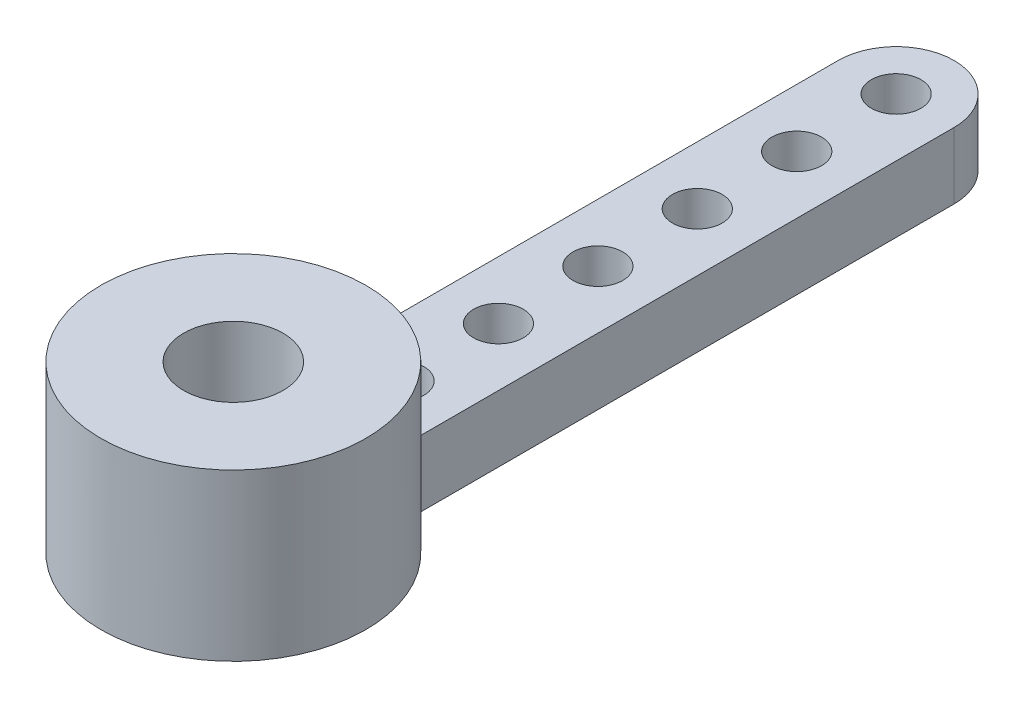
ISO-10303-21;
HEADER;
FILE_DESCRIPTION(('STEP AP214'),'2;1');
FILE_NAME('part.step','',(''),(''),'','','');
FILE_SCHEMA(('AUTOMOTIVE_DESIGN { 1 0 10303 214 1 1 1 1 }'));
ENDSEC;
DATA;
#1=APPLICATION_CONTEXT('core data for automotive mechanical design processes');
#2=APPLICATION_PROTOCOL_DEFINITION('international standard','automotive_design',2000,#1);
#3=PRODUCT_CONTEXT('',#1,'mechanical');
#4=PRODUCT('Part','Part','',(#3));
#5=PRODUCT_RELATED_PRODUCT_CATEGORY('part','',(#4));
#6=PRODUCT_DEFINITION_FORMATION('','',#4);
#7=PRODUCT_DEFINITION_CONTEXT('part definition',#1,'design');
#8=PRODUCT_DEFINITION('design','',#6,#7);
#9=PRODUCT_DEFINITION_SHAPE('','',#8);
#10=(LENGTH_UNIT() NAMED_UNIT(*) SI_UNIT(.MILLI.,.METRE.));
#11=(NAMED_UNIT(*) PLANE_ANGLE_UNIT() SI_UNIT($,.RADIAN.));
#12=(NAMED_UNIT(*) SI_UNIT($,.STERADIAN.) SOLID_ANGLE_UNIT());
#13=UNCERTAINTY_MEASURE_WITH_UNIT(LENGTH_MEASURE(1.E-05),#10,'distance_accuracy_value','');
#14=(GEOMETRIC_REPRESENTATION_CONTEXT(3) GLOBAL_UNCERTAINTY_ASSIGNED_CONTEXT((#13)) GLOBAL_UNIT_ASSIGNED_CONTEXT((#10,
#11,#12)) REPRESENTATION_CONTEXT('',''));
#15=CARTESIAN_POINT('',(0.,0.,0.));
#16=DIRECTION('',(0.,0.,1.));
#17=DIRECTION('',(1.,0.,0.));
#18=AXIS2_PLACEMENT_3D('',#15,#16,#17);
#19=CARTESIAN_POINT('',(-3.5,10.,0.));
#20=DIRECTION('',(1.,0.,0.));
#21=DIRECTION('',(0.,0.,1.));
#22=AXIS2_PLACEMENT_3D('',#19,#20,#21);
#23=PLANE('',#22);
#24=DIRECTION('',(0.,0.,-1.));
#25=VECTOR('',#24,1.);
#26=CARTESIAN_POINT('',(-3.49999999999999,4.,-40.));
#27=LINE('',#26,#25);
#28=CARTESIAN_POINT('',(-3.49999999999999,4.,-7.19374728496908));
#29=VERTEX_POINT('',#28);
#30=CARTESIAN_POINT('',(-3.49999999999999,4.,-40.));
#31=VERTEX_POINT('',#30);
#32=EDGE_CURVE('E102',#29,#31,#27,.T.);
#33=ORIENTED_EDGE('',*,*,#32,.T.);
#34=DIRECTION('',(0.,-1.,0.));
#35=VECTOR('',#34,1.);
#36=CARTESIAN_POINT('',(-3.49999999999999,10.,-40.));
#37=LINE('',#36,#35);
#38=CARTESIAN_POINT('',(-3.49999999999999,0.,-40.));
#39=VERTEX_POINT('',#38);
#40=EDGE_CURVE('E48',#31,#39,#37,.T.);
#41=ORIENTED_EDGE('',*,*,#40,.T.);
#42=DIRECTION('',(0.,0.,-1.));
#43=VECTOR('',#42,1.);
#44=CARTESIAN_POINT('',(-3.5,0.,0.));
#45=LINE('',#44,#43);
#46=CARTESIAN_POINT('',(-3.49999999999999,0.,-7.19374728496908));
#47=VERTEX_POINT('',#46);
#48=EDGE_CURVE('E134',#47,#39,#45,.T.);
#49=ORIENTED_EDGE('',*,*,#48,.F.);
#50=DIRECTION('',(0.,-1.,0.));
#51=VECTOR('',#50,1.);
#52=CARTESIAN_POINT('',(-3.49999999999999,10.,-7.19374728496908));
#53=LINE('',#52,#51);
#54=EDGE_CURVE('E11',#29,#47,#53,.T.);
#55=ORIENTED_EDGE('',*,*,#54,.F.);
#56=EDGE_LOOP('',(#33,#41,#49,#55));
#57=FACE_BOUND('',#56,.T.);
#58=ADVANCED_FACE('F39',(#57),#23,.F.);
#59=CARTESIAN_POINT('',(0.,10.,-40.));
#60=DIRECTION('',(0.,-1.,0.));
#61=DIRECTION('',(0.,0.,1.));
#62=AXIS2_PLACEMENT_3D('',#59,#60,#61);
#63=CYLINDRICAL_SURFACE('',#62,3.49999999999999);
#64=CARTESIAN_POINT('',(0.,4.,-40.));
#65=DIRECTION('',(0.,-1.,0.));
#66=DIRECTION('',(0.,0.,-1.));
#67=AXIS2_PLACEMENT_3D('',#64,#65,#66);
#68=CIRCLE('',#67,3.49999999999999);
#69=CARTESIAN_POINT('',(3.49999999999999,4.,-40.));
#70=VERTEX_POINT('',#69);
#71=EDGE_CURVE('E86',#31,#70,#68,.T.);
#72=ORIENTED_EDGE('',*,*,#71,.T.);
#73=DIRECTION('',(0.,-1.,0.));
#74=VECTOR('',#73,1.);
#75=CARTESIAN_POINT('',(3.5,10.,-40.));
#76=LINE('',#75,#74);
#77=CARTESIAN_POINT('',(3.5,0.,-40.));
#78=VERTEX_POINT('',#77);
#79=EDGE_CURVE('E91',#70,#78,#76,.T.);
#80=ORIENTED_EDGE('',*,*,#79,.T.);
#81=CARTESIAN_POINT('',(0.,0.,-40.));
#82=DIRECTION('',(0.,-1.,0.));
#83=DIRECTION('',(0.,0.,-1.));
#84=AXIS2_PLACEMENT_3D('',#81,#82,#83);
#85=CIRCLE('',#84,3.49999999999999);
#86=EDGE_CURVE('E137',#39,#78,#85,.T.);
#87=ORIENTED_EDGE('',*,*,#86,.F.);
#88=ORIENTED_EDGE('',*,*,#40,.F.);
#89=EDGE_LOOP('',(#72,#80,#87,#88));
#90=FACE_BOUND('',#89,.T.);
#91=ADVANCED_FACE('F96',(#90),#63,.T.);
#92=CARTESIAN_POINT('',(0.,10.,-34.));
#93=DIRECTION('',(0.,-1.,0.));
#94=DIRECTION('',(0.,0.,1.));
#95=AXIS2_PLACEMENT_3D('',#92,#93,#94);
#96=CYLINDRICAL_SURFACE('',#95,1.5);
#97=CARTESIAN_POINT('',(0.,0.,-34.));
#98=DIRECTION('',(0.,-1.,0.));
#99=DIRECTION('',(0.,0.,-1.));
#100=AXIS2_PLACEMENT_3D('',#97,#98,#99);
#101=CIRCLE('',#100,1.5);
#102=CARTESIAN_POINT('',(0.,0.,-35.5));
#103=VERTEX_POINT('',#102);
#104=EDGE_CURVE('E152',#103,#103,#101,.T.);
#105=ORIENTED_EDGE('',*,*,#104,.T.);
#106=EDGE_LOOP('',(#105));
#107=FACE_BOUND('',#106,.T.);
#108=CARTESIAN_POINT('',(0.,4.,-34.));
#109=DIRECTION('',(0.,-1.,0.));
#110=DIRECTION('',(0.,0.,-1.));
#111=AXIS2_PLACEMENT_3D('',#108,#109,#110);
#112=CIRCLE('',#111,1.5);
#113=CARTESIAN_POINT('',(0.,4.,-35.5));
#114=VERTEX_POINT('',#113);
#115=EDGE_CURVE('E116',#114,#114,#112,.T.);
#116=ORIENTED_EDGE('',*,*,#115,.F.);
#117=EDGE_LOOP('',(#116));
#118=FACE_BOUND('',#117,.T.);
#119=ADVANCED_FACE('F204',(#107,#118),#96,.F.);
#120=CARTESIAN_POINT('',(0.,10.,-28.));
#121=DIRECTION('',(0.,-1.,0.));
#122=DIRECTION('',(0.,0.,1.));
#123=AXIS2_PLACEMENT_3D('',#120,#121,#122);
#124=CYLINDRICAL_SURFACE('',#123,1.5);
#125=CARTESIAN_POINT('',(0.,0.,-28.));
#126=DIRECTION('',(0.,-1.,0.));
#127=DIRECTION('',(0.,0.,-1.));
#128=AXIS2_PLACEMENT_3D('',#125,#126,#127);
#129=CIRCLE('',#128,1.5);
#130=CARTESIAN_POINT('',(0.,0.,-29.5));
#131=VERTEX_POINT('',#130);
#132=EDGE_CURVE('E149',#131,#131,#129,.T.);
#133=ORIENTED_EDGE('',*,*,#132,.T.);
#134=EDGE_LOOP('',(#133));
#135=FACE_BOUND('',#134,.T.);
#136=CARTESIAN_POINT('',(0.,4.,-28.));
#137=DIRECTION('',(0.,-1.,0.));
#138=DIRECTION('',(0.,0.,-1.));
#139=AXIS2_PLACEMENT_3D('',#136,#137,#138);
#140=CIRCLE('',#139,1.5);
#141=CARTESIAN_POINT('',(0.,4.,-29.5));
#142=VERTEX_POINT('',#141);
#143=EDGE_CURVE('E113',#142,#142,#140,.T.);
#144=ORIENTED_EDGE('',*,*,#143,.F.);
#145=EDGE_LOOP('',(#144));
#146=FACE_BOUND('',#145,.T.);
#147=ADVANCED_FACE('F220',(#135,#146),#124,.F.);
#148=CARTESIAN_POINT('',(0.,10.,-22.));
#149=DIRECTION('',(0.,-1.,0.));
#150=DIRECTION('',(0.,0.,1.));
#151=AXIS2_PLACEMENT_3D('',#148,#149,#150);
#152=CYLINDRICAL_SURFACE('',#151,1.5);
#153=CARTESIAN_POINT('',(0.,0.,-22.));
#154=DIRECTION('',(0.,-1.,0.));
#155=DIRECTION('',(0.,0.,-1.));
#156=AXIS2_PLACEMENT_3D('',#153,#154,#155);
#157=CIRCLE('',#156,1.5);
#158=CARTESIAN_POINT('',(0.,0.,-23.5));
#159=VERTEX_POINT('',#158);
#160=EDGE_CURVE('E146',#159,#159,#157,.T.);
#161=ORIENTED_EDGE('',*,*,#160,.T.);
#162=EDGE_LOOP('',(#161));
#163=FACE_BOUND('',#162,.T.);
#164=CARTESIAN_POINT('',(0.,4.,-22.));
#165=DIRECTION('',(0.,-1.,0.));
#166=DIRECTION('',(0.,0.,-1.));
#167=AXIS2_PLACEMENT_3D('',#164,#165,#166);
#168=CIRCLE('',#167,1.5);
#169=CARTESIAN_POINT('',(0.,4.,-23.5));
#170=VERTEX_POINT('',#169);
#171=EDGE_CURVE('E110',#170,#170,#168,.T.);
#172=ORIENTED_EDGE('',*,*,#171,.F.);
#173=EDGE_LOOP('',(#172));
#174=FACE_BOUND('',#173,.T.);
#175=ADVANCED_FACE('F216',(#163,#174),#152,.F.);
#176=CARTESIAN_POINT('',(0.,10.,-16.));
#177=DIRECTION('',(0.,-1.,0.));
#178=DIRECTION('',(0.,0.,1.));
#179=AXIS2_PLACEMENT_3D('',#176,#177,#178);
#180=CYLINDRICAL_SURFACE('',#179,1.5);
#181=CARTESIAN_POINT('',(0.,0.,-16.));
#182=DIRECTION('',(0.,-1.,0.));
#183=DIRECTION('',(0.,0.,-1.));
#184=AXIS2_PLACEMENT_3D('',#181,#182,#183);
#185=CIRCLE('',#184,1.5);
#186=CARTESIAN_POINT('',(0.,0.,-17.5));
#187=VERTEX_POINT('',#186);
#188=EDGE_CURVE('E143',#187,#187,#185,.T.);
#189=ORIENTED_EDGE('',*,*,#188,.T.);
#190=EDGE_LOOP('',(#189));
#191=FACE_BOUND('',#190,.T.);
#192=CARTESIAN_POINT('',(0.,4.,-16.));
#193=DIRECTION('',(0.,-1.,0.));
#194=DIRECTION('',(0.,0.,-1.));
#195=AXIS2_PLACEMENT_3D('',#192,#193,#194);
#196=CIRCLE('',#195,1.5);
#197=CARTESIAN_POINT('',(0.,4.,-17.5));
#198=VERTEX_POINT('',#197);
#199=EDGE_CURVE('E107',#198,#198,#196,.T.);
#200=ORIENTED_EDGE('',*,*,#199,.F.);
#201=EDGE_LOOP('',(#200));
#202=FACE_BOUND('',#201,.T.);
#203=ADVANCED_FACE('F212',(#191,#202),#180,.F.);
#204=CARTESIAN_POINT('',(-1.04744440165294E-13,10.,-10.));
#205=DIRECTION('',(0.,-1.,0.));
#206=DIRECTION('',(0.,0.,1.));
#207=AXIS2_PLACEMENT_3D('',#204,#205,#206);
#208=CYLINDRICAL_SURFACE('',#207,1.5);
#209=CARTESIAN_POINT('',(-1.04744440165294E-13,0.,-10.));
#210=DIRECTION('',(0.,-1.,0.));
#211=DIRECTION('',(0.,0.,-1.));
#212=AXIS2_PLACEMENT_3D('',#209,#210,#211);
#213=CIRCLE('',#212,1.5);
#214=CARTESIAN_POINT('',(-1.04744440165294E-13,0.,-11.5));
#215=VERTEX_POINT('',#214);
#216=EDGE_CURVE('E140',#215,#215,#213,.T.);
#217=ORIENTED_EDGE('',*,*,#216,.T.);
#218=EDGE_LOOP('',(#217));
#219=FACE_BOUND('',#218,.T.);
#220=CARTESIAN_POINT('',(-1.04744440165294E-13,4.,-10.));
#221=DIRECTION('',(0.,-1.,0.));
#222=DIRECTION('',(0.,0.,-1.));
#223=AXIS2_PLACEMENT_3D('',#220,#221,#222);
#224=CIRCLE('',#223,1.5);
#225=CARTESIAN_POINT('',(-1.04744440165294E-13,4.,-11.5));
#226=VERTEX_POINT('',#225);
#227=EDGE_CURVE('E104',#226,#226,#224,.T.);
#228=ORIENTED_EDGE('',*,*,#227,.F.);
#229=EDGE_LOOP('',(#228));
#230=FACE_BOUND('',#229,.T.);
#231=ADVANCED_FACE('F209',(#219,#230),#208,.F.);
#232=CARTESIAN_POINT('',(3.5,10.,0.));
#233=DIRECTION('',(1.,0.,0.));
#234=DIRECTION('',(0.,0.,1.));
#235=AXIS2_PLACEMENT_3D('',#232,#233,#234);
#236=PLANE('',#235);
#237=DIRECTION('',(0.,-1.,0.));
#238=VECTOR('',#237,1.);
#239=CARTESIAN_POINT('',(3.5,10.,-7.19374728496908));
#240=LINE('',#239,#238);
#241=CARTESIAN_POINT('',(3.5,4.,-7.19374728496908));
#242=VERTEX_POINT('',#241);
#243=CARTESIAN_POINT('',(3.5,0.,-7.19374728496908));
#244=VERTEX_POINT('',#243);
#245=EDGE_CURVE('E94',#242,#244,#240,.T.);
#246=ORIENTED_EDGE('',*,*,#245,.T.);
#247=DIRECTION('',(0.,0.,-1.));
#248=VECTOR('',#247,1.);
#249=CARTESIAN_POINT('',(3.5,0.,0.));
#250=LINE('',#249,#248);
#251=EDGE_CURVE('E62',#244,#78,#250,.T.);
#252=ORIENTED_EDGE('',*,*,#251,.T.);
#253=ORIENTED_EDGE('',*,*,#79,.F.);
#254=DIRECTION('',(0.,0.,1.));
#255=VECTOR('',#254,1.);
#256=CARTESIAN_POINT('',(3.49999999999999,4.,-40.));
#257=LINE('',#256,#255);
#258=EDGE_CURVE('E82',#70,#242,#257,.T.);
#259=ORIENTED_EDGE('',*,*,#258,.T.);
#260=EDGE_LOOP('',(#246,#252,#253,#259));
#261=FACE_BOUND('',#260,.T.);
#262=ADVANCED_FACE('F92',(#261),#236,.T.);
#263=CARTESIAN_POINT('',(0.,10.,-40.));
#264=DIRECTION('',(0.,-1.,0.));
#265=DIRECTION('',(0.,0.,1.));
#266=AXIS2_PLACEMENT_3D('',#263,#264,#265);
#267=CYLINDRICAL_SURFACE('',#266,1.5);
#268=CARTESIAN_POINT('',(0.,0.,-40.));
#269=DIRECTION('',(0.,-1.,0.));
#270=DIRECTION('',(0.,0.,-1.));
#271=AXIS2_PLACEMENT_3D('',#268,#269,#270);
#272=CIRCLE('',#271,1.5);
#273=CARTESIAN_POINT('',(0.,0.,-41.5));
#274=VERTEX_POINT('',#273);
#275=EDGE_CURVE('E132',#274,#274,#272,.T.);
#276=ORIENTED_EDGE('',*,*,#275,.T.);
#277=EDGE_LOOP('',(#276));
#278=FACE_BOUND('',#277,.T.);
#279=CARTESIAN_POINT('',(0.,4.,-40.));
#280=DIRECTION('',(0.,-1.,0.));
#281=DIRECTION('',(0.,0.,-1.));
#282=AXIS2_PLACEMENT_3D('',#279,#280,#281);
#283=CIRCLE('',#282,1.5);
#284=CARTESIAN_POINT('',(0.,4.,-41.5));
#285=VERTEX_POINT('',#284);
#286=EDGE_CURVE('E43',#285,#285,#283,.T.);
#287=ORIENTED_EDGE('',*,*,#286,.F.);
#288=EDGE_LOOP('',(#287));
#289=FACE_BOUND('',#288,.T.);
#290=ADVANCED_FACE('F182',(#278,#289),#267,.F.);
#291=CARTESIAN_POINT('',(0.,10.,0.));
#292=DIRECTION('',(0.,-1.,0.));
#293=DIRECTION('',(0.,0.,1.));
#294=AXIS2_PLACEMENT_3D('',#291,#292,#293);
#295=CYLINDRICAL_SURFACE('',#294,8.);
#296=ORIENTED_EDGE('',*,*,#54,.T.);
#297=CARTESIAN_POINT('',(0.,0.,0.));
#298=DIRECTION('',(0.,-1.,0.));
#299=DIRECTION('',(0.,0.,-1.));
#300=AXIS2_PLACEMENT_3D('',#297,#298,#299);
#301=CIRCLE('',#300,8.);
#302=EDGE_CURVE('E55',#244,#47,#301,.T.);
#303=ORIENTED_EDGE('',*,*,#302,.F.);
#304=ORIENTED_EDGE('',*,*,#245,.F.);
#305=CARTESIAN_POINT('',(0.,4.,0.));
#306=DIRECTION('',(0.,1.,0.));
#307=DIRECTION('',(0.,0.,1.));
#308=AXIS2_PLACEMENT_3D('',#305,#306,#307);
#309=CIRCLE('',#308,8.);
#310=EDGE_CURVE('E88',#242,#29,#309,.T.);
#311=ORIENTED_EDGE('',*,*,#310,.T.);
#312=EDGE_LOOP('',(#296,#303,#304,#311));
#313=FACE_BOUND('',#312,.T.);
#314=CARTESIAN_POINT('',(0.,10.,0.));
#315=DIRECTION('',(0.,-1.,0.));
#316=DIRECTION('',(0.,0.,-1.));
#317=AXIS2_PLACEMENT_3D('',#314,#315,#316);
#318=CIRCLE('',#317,8.);
#319=CARTESIAN_POINT('',(0.,10.,-8.));
#320=VERTEX_POINT('',#319);
#321=EDGE_CURVE('E129',#320,#320,#318,.T.);
#322=ORIENTED_EDGE('',*,*,#321,.T.);
#323=EDGE_LOOP('',(#322));
#324=FACE_BOUND('',#323,.T.);
#325=ADVANCED_FACE('F41',(#313,#324),#295,.T.);
#326=CARTESIAN_POINT('',(0.,10.,0.));
#327=DIRECTION('',(0.,1.,0.));
#328=DIRECTION('',(0.,0.,-1.));
#329=AXIS2_PLACEMENT_3D('',#326,#327,#328);
#330=PLANE('',#329);
#331=ORIENTED_EDGE('',*,*,#321,.F.);
#332=EDGE_LOOP('',(#331));
#333=FACE_BOUND('',#332,.T.);
#334=CARTESIAN_POINT('',(0.,10.,0.));
#335=DIRECTION('',(0.,-1.,0.));
#336=DIRECTION('',(0.,0.,-1.));
#337=AXIS2_PLACEMENT_3D('',#334,#335,#336);
#338=CIRCLE('',#337,3.);
#339=CARTESIAN_POINT('',(0.,10.,-3.));
#340=VERTEX_POINT('',#339);
#341=EDGE_CURVE('E126',#340,#340,#338,.T.);
#342=ORIENTED_EDGE('',*,*,#341,.T.);
#343=EDGE_LOOP('',(#342));
#344=FACE_BOUND('',#343,.T.);
#345=ADVANCED_FACE('F167',(#333,#344),#330,.T.);
#346=CARTESIAN_POINT('',(0.,0.,0.));
#347=DIRECTION('',(0.,1.,0.));
#348=DIRECTION('',(0.,0.,-1.));
#349=AXIS2_PLACEMENT_3D('',#346,#347,#348);
#350=PLANE('',#349);
#351=CARTESIAN_POINT('',(0.,0.,0.));
#352=DIRECTION('',(0.,-1.,0.));
#353=DIRECTION('',(0.,0.,-1.));
#354=AXIS2_PLACEMENT_3D('',#351,#352,#353);
#355=CIRCLE('',#354,1.5);
#356=CARTESIAN_POINT('',(0.,0.,-1.5));
#357=VERTEX_POINT('',#356);
#358=EDGE_CURVE('E122',#357,#357,#355,.T.);
#359=ORIENTED_EDGE('',*,*,#358,.F.);
#360=EDGE_LOOP('',(#359));
#361=FACE_BOUND('',#360,.T.);
#362=ORIENTED_EDGE('',*,*,#302,.T.);
#363=ORIENTED_EDGE('',*,*,#48,.T.);
#364=ORIENTED_EDGE('',*,*,#86,.T.);
#365=ORIENTED_EDGE('',*,*,#251,.F.);
#366=EDGE_LOOP('',(#362,#363,#364,#365));
#367=FACE_BOUND('',#366,.T.);
#368=ORIENTED_EDGE('',*,*,#216,.F.);
#369=EDGE_LOOP('',(#368));
#370=FACE_BOUND('',#369,.T.);
#371=ORIENTED_EDGE('',*,*,#188,.F.);
#372=EDGE_LOOP('',(#371));
#373=FACE_BOUND('',#372,.T.);
#374=ORIENTED_EDGE('',*,*,#160,.F.);
#375=EDGE_LOOP('',(#374));
#376=FACE_BOUND('',#375,.T.);
#377=ORIENTED_EDGE('',*,*,#132,.F.);
#378=EDGE_LOOP('',(#377));
#379=FACE_BOUND('',#378,.T.);
#380=ORIENTED_EDGE('',*,*,#104,.F.);
#381=EDGE_LOOP('',(#380));
#382=FACE_BOUND('',#381,.T.);
#383=ORIENTED_EDGE('',*,*,#275,.F.);
#384=EDGE_LOOP('',(#383));
#385=FACE_BOUND('',#384,.T.);
#386=ADVANCED_FACE('F163',(#361,#367,#370,#373,#376,#379,#382,#385),#350,.F.);
#387=CARTESIAN_POINT('',(0.,4.,0.));
#388=DIRECTION('',(0.,1.,0.));
#389=DIRECTION('',(0.,0.,-1.));
#390=AXIS2_PLACEMENT_3D('',#387,#388,#389);
#391=CYLINDRICAL_SURFACE('',#390,3.);
#392=CARTESIAN_POINT('',(0.,4.,0.));
#393=DIRECTION('',(0.,-1.,0.));
#394=DIRECTION('',(0.,0.,-1.));
#395=AXIS2_PLACEMENT_3D('',#392,#393,#394);
#396=CIRCLE('',#395,3.);
#397=CARTESIAN_POINT('',(0.,4.,-3.));
#398=VERTEX_POINT('',#397);
#399=EDGE_CURVE('E123',#398,#398,#396,.T.);
#400=ORIENTED_EDGE('',*,*,#399,.T.);
#401=EDGE_LOOP('',(#400));
#402=FACE_BOUND('',#401,.T.);
#403=ORIENTED_EDGE('',*,*,#341,.F.);
#404=EDGE_LOOP('',(#403));
#405=FACE_BOUND('',#404,.T.);
#406=ADVANCED_FACE('F166',(#402,#405),#391,.F.);
#407=CARTESIAN_POINT('',(0.,4.,0.));
#408=DIRECTION('',(0.,1.,0.));
#409=DIRECTION('',(0.,0.,-1.));
#410=AXIS2_PLACEMENT_3D('',#407,#408,#409);
#411=PLANE('',#410);
#412=CARTESIAN_POINT('',(0.,4.,0.));
#413=DIRECTION('',(0.,-1.,0.));
#414=DIRECTION('',(0.,0.,-1.));
#415=AXIS2_PLACEMENT_3D('',#412,#413,#414);
#416=CIRCLE('',#415,1.5);
#417=CARTESIAN_POINT('',(0.,4.,-1.5));
#418=VERTEX_POINT('',#417);
#419=EDGE_CURVE('E119',#418,#418,#416,.T.);
#420=ORIENTED_EDGE('',*,*,#419,.T.);
#421=EDGE_LOOP('',(#420));
#422=FACE_BOUND('',#421,.T.);
#423=ORIENTED_EDGE('',*,*,#399,.F.);
#424=EDGE_LOOP('',(#423));
#425=FACE_BOUND('',#424,.T.);
#426=ADVANCED_FACE('F195',(#422,#425),#411,.T.);
#427=CARTESIAN_POINT('',(0.,-2.,0.));
#428=DIRECTION('',(0.,1.,0.));
#429=DIRECTION('',(0.,0.,-1.));
#430=AXIS2_PLACEMENT_3D('',#427,#428,#429);
#431=CYLINDRICAL_SURFACE('',#430,1.5);
#432=ORIENTED_EDGE('',*,*,#419,.F.);
#433=EDGE_LOOP('',(#432));
#434=FACE_BOUND('',#433,.T.);
#435=ORIENTED_EDGE('',*,*,#358,.T.);
#436=EDGE_LOOP('',(#435));
#437=FACE_BOUND('',#436,.T.);
#438=ADVANCED_FACE('F161',(#434,#437),#431,.F.);
#439=CARTESIAN_POINT('',(0.,4.,-40.));
#440=DIRECTION('',(0.,1.,0.));
#441=DIRECTION('',(0.,0.,-1.));
#442=AXIS2_PLACEMENT_3D('',#439,#440,#441);
#443=PLANE('',#442);
#444=ORIENTED_EDGE('',*,*,#115,.T.);
#445=EDGE_LOOP('',(#444));
#446=FACE_BOUND('',#445,.T.);
#447=ORIENTED_EDGE('',*,*,#143,.T.);
#448=EDGE_LOOP('',(#447));
#449=FACE_BOUND('',#448,.T.);
#450=ORIENTED_EDGE('',*,*,#171,.T.);
#451=EDGE_LOOP('',(#450));
#452=FACE_BOUND('',#451,.T.);
#453=ORIENTED_EDGE('',*,*,#199,.T.);
#454=EDGE_LOOP('',(#453));
#455=FACE_BOUND('',#454,.T.);
#456=ORIENTED_EDGE('',*,*,#227,.T.);
#457=EDGE_LOOP('',(#456));
#458=FACE_BOUND('',#457,.T.);
#459=ORIENTED_EDGE('',*,*,#286,.T.);
#460=EDGE_LOOP('',(#459));
#461=FACE_BOUND('',#460,.T.);
#462=ORIENTED_EDGE('',*,*,#71,.F.);
#463=ORIENTED_EDGE('',*,*,#32,.F.);
#464=ORIENTED_EDGE('',*,*,#310,.F.);
#465=ORIENTED_EDGE('',*,*,#258,.F.);
#466=EDGE_LOOP('',(#462,#463,#464,#465));
#467=FACE_BOUND('',#466,.T.);
#468=ADVANCED_FACE('F83',(#446,#449,#452,#455,#458,#461,#467),#443,.T.);
#469=CLOSED_SHELL('',(#58,#91,#119,#147,#175,#203,#231,#262,#290,#325,#345,#386,#406,#426,#438,#468));
#470=MANIFOLD_SOLID_BREP('B2',#469);
#471=ADVANCED_BREP_SHAPE_REPRESENTATION('',(#18,#470),#14);
#472=SHAPE_DEFINITION_REPRESENTATION(#9,#471);
ENDSEC;
END-ISO-10303-21;
